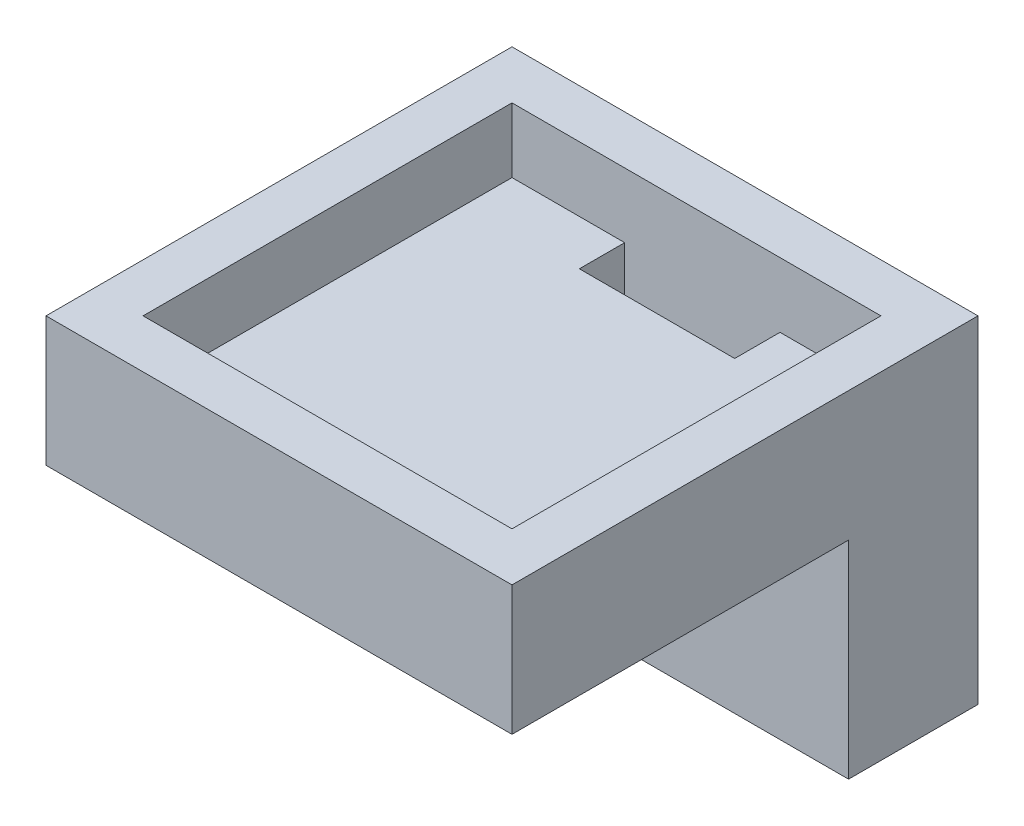
ISO-10303-21;
HEADER;
FILE_DESCRIPTION(('STEP AP214'),'2;1');
FILE_NAME('part.step','',(''),(''),'','','');
FILE_SCHEMA(('AUTOMOTIVE_DESIGN { 1 0 10303 214 1 1 1 1 }'));
ENDSEC;
DATA;
#1=APPLICATION_CONTEXT('core data for automotive mechanical design processes');
#2=APPLICATION_PROTOCOL_DEFINITION('international standard','automotive_design',2000,#1);
#3=PRODUCT_CONTEXT('',#1,'mechanical');
#4=PRODUCT('Part','Part','',(#3));
#5=PRODUCT_RELATED_PRODUCT_CATEGORY('part','',(#4));
#6=PRODUCT_DEFINITION_FORMATION('','',#4);
#7=PRODUCT_DEFINITION_CONTEXT('part definition',#1,'design');
#8=PRODUCT_DEFINITION('design','',#6,#7);
#9=PRODUCT_DEFINITION_SHAPE('','',#8);
#10=(LENGTH_UNIT() NAMED_UNIT(*) SI_UNIT(.MILLI.,.METRE.));
#11=(NAMED_UNIT(*) PLANE_ANGLE_UNIT() SI_UNIT($,.RADIAN.));
#12=(NAMED_UNIT(*) SI_UNIT($,.STERADIAN.) SOLID_ANGLE_UNIT());
#13=UNCERTAINTY_MEASURE_WITH_UNIT(LENGTH_MEASURE(1.E-05),#10,'distance_accuracy_value','');
#14=(GEOMETRIC_REPRESENTATION_CONTEXT(3) GLOBAL_UNCERTAINTY_ASSIGNED_CONTEXT((#13)) GLOBAL_UNIT_ASSIGNED_CONTEXT((#10,
#11,#12)) REPRESENTATION_CONTEXT('',''));
#15=CARTESIAN_POINT('',(0.,0.,0.));
#16=DIRECTION('',(0.,0.,1.));
#17=DIRECTION('',(1.,0.,0.));
#18=AXIS2_PLACEMENT_3D('',#15,#16,#17);
#19=CARTESIAN_POINT('',(0.,5.,0.));
#20=DIRECTION('',(0.,1.,0.));
#21=DIRECTION('',(0.,0.,1.));
#22=AXIS2_PLACEMENT_3D('',#19,#20,#21);
#23=PLANE('',#22);
#24=DIRECTION('',(1.,0.,0.));
#25=VECTOR('',#24,1.);
#26=CARTESIAN_POINT('',(0.,5.,-14.25));
#27=LINE('',#26,#25);
#28=CARTESIAN_POINT('',(6.45474748590523,5.,-14.25));
#29=VERTEX_POINT('',#28);
#30=CARTESIAN_POINT('',(14.25,5.,-14.25));
#31=VERTEX_POINT('',#30);
#32=EDGE_CURVE('E244',#29,#31,#27,.T.);
#33=ORIENTED_EDGE('',*,*,#32,.F.);
#34=DIRECTION('',(0.,0.,-1.));
#35=VECTOR('',#34,1.);
#36=CARTESIAN_POINT('',(6.45474748590523,5.,-14.25));
#37=LINE('',#36,#35);
#38=CARTESIAN_POINT('',(6.45474748590523,5.,-10.75));
#39=VERTEX_POINT('',#38);
#40=EDGE_CURVE('E259',#39,#29,#37,.T.);
#41=ORIENTED_EDGE('',*,*,#40,.F.);
#42=DIRECTION('',(1.,0.,0.));
#43=VECTOR('',#42,1.);
#44=CARTESIAN_POINT('',(-5.54525251409477,5.,-10.75));
#45=LINE('',#44,#43);
#46=CARTESIAN_POINT('',(-5.54525251409477,5.,-10.75));
#47=VERTEX_POINT('',#46);
#48=EDGE_CURVE('E265',#47,#39,#45,.T.);
#49=ORIENTED_EDGE('',*,*,#48,.F.);
#50=DIRECTION('',(0.,0.,1.));
#51=VECTOR('',#50,1.);
#52=CARTESIAN_POINT('',(-5.54525251409477,5.,-14.25));
#53=LINE('',#52,#51);
#54=CARTESIAN_POINT('',(-5.54525251409477,5.,-14.25));
#55=VERTEX_POINT('',#54);
#56=EDGE_CURVE('E148',#55,#47,#53,.T.);
#57=ORIENTED_EDGE('',*,*,#56,.F.);
#58=CARTESIAN_POINT('',(-14.25,5.,-14.25));
#59=VERTEX_POINT('',#58);
#60=EDGE_CURVE('E245',#59,#55,#27,.T.);
#61=ORIENTED_EDGE('',*,*,#60,.F.);
#62=DIRECTION('',(0.,0.,-1.));
#63=VECTOR('',#62,1.);
#64=CARTESIAN_POINT('',(-14.25,5.,0.));
#65=LINE('',#64,#63);
#66=CARTESIAN_POINT('',(-14.25,5.,14.25));
#67=VERTEX_POINT('',#66);
#68=EDGE_CURVE('E253',#67,#59,#65,.T.);
#69=ORIENTED_EDGE('',*,*,#68,.F.);
#70=DIRECTION('',(-1.,0.,0.));
#71=VECTOR('',#70,1.);
#72=CARTESIAN_POINT('',(0.,5.,14.25));
#73=LINE('',#72,#71);
#74=CARTESIAN_POINT('',(14.25,5.,14.25));
#75=VERTEX_POINT('',#74);
#76=EDGE_CURVE('E249',#75,#67,#73,.T.);
#77=ORIENTED_EDGE('',*,*,#76,.F.);
#78=DIRECTION('',(0.,0.,1.));
#79=VECTOR('',#78,1.);
#80=CARTESIAN_POINT('',(14.25,5.,0.));
#81=LINE('',#80,#79);
#82=EDGE_CURVE('E63',#31,#75,#81,.T.);
#83=ORIENTED_EDGE('',*,*,#82,.F.);
#84=EDGE_LOOP('',(#33,#41,#49,#57,#61,#69,#77,#83));
#85=FACE_BOUND('',#84,.T.);
#86=ADVANCED_FACE('F39',(#85),#23,.T.);
#87=CARTESIAN_POINT('',(0.,0.,0.));
#88=DIRECTION('',(0.,1.,0.));
#89=DIRECTION('',(0.,0.,1.));
#90=AXIS2_PLACEMENT_3D('',#87,#88,#89);
#91=PLANE('',#90);
#92=DIRECTION('',(0.,0.,1.));
#93=VECTOR('',#92,1.);
#94=CARTESIAN_POINT('',(-18.,0.,-18.));
#95=LINE('',#94,#93);
#96=CARTESIAN_POINT('',(-18.,0.,-8.00000000000003));
#97=VERTEX_POINT('',#96);
#98=CARTESIAN_POINT('',(-18.,0.,18.));
#99=VERTEX_POINT('',#98);
#100=EDGE_CURVE('E279',#97,#99,#95,.T.);
#101=ORIENTED_EDGE('',*,*,#100,.F.);
#102=DIRECTION('',(1.,0.,0.));
#103=VECTOR('',#102,1.);
#104=CARTESIAN_POINT('',(-18.,0.,-8.00000000000003));
#105=LINE('',#104,#103);
#106=CARTESIAN_POINT('',(18.,0.,-8.00000000000003));
#107=VERTEX_POINT('',#106);
#108=EDGE_CURVE('E176',#97,#107,#105,.T.);
#109=ORIENTED_EDGE('',*,*,#108,.T.);
#110=DIRECTION('',(0.,0.,-1.));
#111=VECTOR('',#110,1.);
#112=CARTESIAN_POINT('',(18.,0.,-18.));
#113=LINE('',#112,#111);
#114=CARTESIAN_POINT('',(18.,0.,18.));
#115=VERTEX_POINT('',#114);
#116=EDGE_CURVE('E275',#115,#107,#113,.T.);
#117=ORIENTED_EDGE('',*,*,#116,.F.);
#118=DIRECTION('',(1.,0.,0.));
#119=VECTOR('',#118,1.);
#120=CARTESIAN_POINT('',(-18.,0.,18.));
#121=LINE('',#120,#119);
#122=EDGE_CURVE('E282',#99,#115,#121,.T.);
#123=ORIENTED_EDGE('',*,*,#122,.F.);
#124=EDGE_LOOP('',(#101,#109,#117,#123));
#125=FACE_BOUND('',#124,.T.);
#126=ADVANCED_FACE('F313',(#125),#91,.F.);
#127=CARTESIAN_POINT('',(18.,5.,-18.));
#128=DIRECTION('',(-1.,0.,0.));
#129=DIRECTION('',(0.,0.,1.));
#130=AXIS2_PLACEMENT_3D('',#127,#128,#129);
#131=PLANE('',#130);
#132=ORIENTED_EDGE('',*,*,#116,.T.);
#133=DIRECTION('',(0.,1.,0.));
#134=VECTOR('',#133,1.);
#135=CARTESIAN_POINT('',(18.,-16.,-8.00000000000003));
#136=LINE('',#135,#134);
#137=CARTESIAN_POINT('',(18.,-16.,-8.00000000000003));
#138=VERTEX_POINT('',#137);
#139=EDGE_CURVE('E55',#138,#107,#136,.T.);
#140=ORIENTED_EDGE('',*,*,#139,.F.);
#141=DIRECTION('',(0.,0.,-1.));
#142=VECTOR('',#141,1.);
#143=CARTESIAN_POINT('',(18.,-16.,-18.));
#144=LINE('',#143,#142);
#145=CARTESIAN_POINT('',(18.,-16.,-18.));
#146=VERTEX_POINT('',#145);
#147=EDGE_CURVE('E184',#138,#146,#144,.T.);
#148=ORIENTED_EDGE('',*,*,#147,.T.);
#149=DIRECTION('',(0.,-1.,0.));
#150=VECTOR('',#149,1.);
#151=CARTESIAN_POINT('',(18.,5.,-18.));
#152=LINE('',#151,#150);
#153=CARTESIAN_POINT('',(18.,10.,-18.));
#154=VERTEX_POINT('',#153);
#155=EDGE_CURVE('E11',#154,#146,#152,.T.);
#156=ORIENTED_EDGE('',*,*,#155,.F.);
#157=DIRECTION('',(0.,0.,-1.));
#158=VECTOR('',#157,1.);
#159=CARTESIAN_POINT('',(18.,10.,-18.));
#160=LINE('',#159,#158);
#161=CARTESIAN_POINT('',(18.,10.,18.));
#162=VERTEX_POINT('',#161);
#163=EDGE_CURVE('E228',#162,#154,#160,.T.);
#164=ORIENTED_EDGE('',*,*,#163,.F.);
#165=DIRECTION('',(0.,-1.,0.));
#166=VECTOR('',#165,1.);
#167=CARTESIAN_POINT('',(18.,5.,18.));
#168=LINE('',#167,#166);
#169=EDGE_CURVE('E285',#162,#115,#168,.T.);
#170=ORIENTED_EDGE('',*,*,#169,.T.);
#171=EDGE_LOOP('',(#132,#140,#148,#156,#164,#170));
#172=FACE_BOUND('',#171,.T.);
#173=ADVANCED_FACE('F41',(#172),#131,.F.);
#174=CARTESIAN_POINT('',(-18.,5.,-18.));
#175=DIRECTION('',(0.,0.,1.));
#176=DIRECTION('',(1.,0.,0.));
#177=AXIS2_PLACEMENT_3D('',#174,#175,#176);
#178=PLANE('',#177);
#179=ORIENTED_EDGE('',*,*,#155,.T.);
#180=DIRECTION('',(-1.,0.,0.));
#181=VECTOR('',#180,1.);
#182=CARTESIAN_POINT('',(-18.,-16.,-18.));
#183=LINE('',#182,#181);
#184=CARTESIAN_POINT('',(-18.,-16.,-18.));
#185=VERTEX_POINT('',#184);
#186=EDGE_CURVE('E188',#146,#185,#183,.T.);
#187=ORIENTED_EDGE('',*,*,#186,.T.);
#188=DIRECTION('',(0.,-1.,0.));
#189=VECTOR('',#188,1.);
#190=CARTESIAN_POINT('',(-18.,5.,-18.));
#191=LINE('',#190,#189);
#192=CARTESIAN_POINT('',(-18.,10.,-18.));
#193=VERTEX_POINT('',#192);
#194=EDGE_CURVE('E48',#193,#185,#191,.T.);
#195=ORIENTED_EDGE('',*,*,#194,.F.);
#196=DIRECTION('',(-1.,0.,0.));
#197=VECTOR('',#196,1.);
#198=CARTESIAN_POINT('',(-18.,10.,-18.));
#199=LINE('',#198,#197);
#200=EDGE_CURVE('E232',#154,#193,#199,.T.);
#201=ORIENTED_EDGE('',*,*,#200,.F.);
#202=EDGE_LOOP('',(#179,#187,#195,#201));
#203=FACE_BOUND('',#202,.T.);
#204=ADVANCED_FACE('F302',(#203),#178,.F.);
#205=CARTESIAN_POINT('',(-18.,5.,-18.));
#206=DIRECTION('',(1.,0.,0.));
#207=DIRECTION('',(0.,0.,-1.));
#208=AXIS2_PLACEMENT_3D('',#205,#206,#207);
#209=PLANE('',#208);
#210=ORIENTED_EDGE('',*,*,#194,.T.);
#211=DIRECTION('',(0.,0.,1.));
#212=VECTOR('',#211,1.);
#213=CARTESIAN_POINT('',(-18.,-16.,-18.));
#214=LINE('',#213,#212);
#215=CARTESIAN_POINT('',(-18.,-16.,-8.00000000000003));
#216=VERTEX_POINT('',#215);
#217=EDGE_CURVE('E177',#185,#216,#214,.T.);
#218=ORIENTED_EDGE('',*,*,#217,.T.);
#219=DIRECTION('',(0.,1.,0.));
#220=VECTOR('',#219,1.);
#221=CARTESIAN_POINT('',(-18.,-16.,-8.00000000000003));
#222=LINE('',#221,#220);
#223=EDGE_CURVE('E192',#216,#97,#222,.T.);
#224=ORIENTED_EDGE('',*,*,#223,.T.);
#225=ORIENTED_EDGE('',*,*,#100,.T.);
#226=DIRECTION('',(0.,-1.,0.));
#227=VECTOR('',#226,1.);
#228=CARTESIAN_POINT('',(-18.,5.,18.));
#229=LINE('',#228,#227);
#230=CARTESIAN_POINT('',(-18.,10.,18.));
#231=VERTEX_POINT('',#230);
#232=EDGE_CURVE('E289',#231,#99,#229,.T.);
#233=ORIENTED_EDGE('',*,*,#232,.F.);
#234=DIRECTION('',(0.,0.,1.));
#235=VECTOR('',#234,1.);
#236=CARTESIAN_POINT('',(-18.,10.,-18.));
#237=LINE('',#236,#235);
#238=EDGE_CURVE('E236',#193,#231,#237,.T.);
#239=ORIENTED_EDGE('',*,*,#238,.F.);
#240=EDGE_LOOP('',(#210,#218,#224,#225,#233,#239));
#241=FACE_BOUND('',#240,.T.);
#242=ADVANCED_FACE('F296',(#241),#209,.F.);
#243=CARTESIAN_POINT('',(-18.,5.,18.));
#244=DIRECTION('',(0.,0.,-1.));
#245=DIRECTION('',(-1.,0.,0.));
#246=AXIS2_PLACEMENT_3D('',#243,#244,#245);
#247=PLANE('',#246);
#248=ORIENTED_EDGE('',*,*,#122,.T.);
#249=ORIENTED_EDGE('',*,*,#169,.F.);
#250=DIRECTION('',(1.,0.,0.));
#251=VECTOR('',#250,1.);
#252=CARTESIAN_POINT('',(-18.,10.,18.));
#253=LINE('',#252,#251);
#254=EDGE_CURVE('E240',#231,#162,#253,.T.);
#255=ORIENTED_EDGE('',*,*,#254,.F.);
#256=ORIENTED_EDGE('',*,*,#232,.T.);
#257=EDGE_LOOP('',(#248,#249,#255,#256));
#258=FACE_BOUND('',#257,.T.);
#259=ADVANCED_FACE('F311',(#258),#247,.F.);
#260=CARTESIAN_POINT('',(6.45474748590523,5.,-14.25));
#261=DIRECTION('',(-1.,0.,0.));
#262=DIRECTION('',(0.,0.,1.));
#263=AXIS2_PLACEMENT_3D('',#260,#261,#262);
#264=PLANE('',#263);
#265=DIRECTION('',(0.,-1.,0.));
#266=VECTOR('',#265,1.);
#267=CARTESIAN_POINT('',(6.45474748590523,5.,-14.25));
#268=LINE('',#267,#266);
#269=CARTESIAN_POINT('',(6.45474748590523,-16.,-14.25));
#270=VERTEX_POINT('',#269);
#271=EDGE_CURVE('E272',#29,#270,#268,.T.);
#272=ORIENTED_EDGE('',*,*,#271,.T.);
#273=DIRECTION('',(0.,0.,-1.));
#274=VECTOR('',#273,1.);
#275=CARTESIAN_POINT('',(6.45474748590523,-16.,-14.25));
#276=LINE('',#275,#274);
#277=CARTESIAN_POINT('',(6.45474748590523,-16.,-10.75));
#278=VERTEX_POINT('',#277);
#279=EDGE_CURVE('E163',#278,#270,#276,.T.);
#280=ORIENTED_EDGE('',*,*,#279,.F.);
#281=DIRECTION('',(0.,-1.,0.));
#282=VECTOR('',#281,1.);
#283=CARTESIAN_POINT('',(6.45474748590523,5.,-10.75));
#284=LINE('',#283,#282);
#285=EDGE_CURVE('E153',#39,#278,#284,.T.);
#286=ORIENTED_EDGE('',*,*,#285,.F.);
#287=ORIENTED_EDGE('',*,*,#40,.T.);
#288=EDGE_LOOP('',(#272,#280,#286,#287));
#289=FACE_BOUND('',#288,.T.);
#290=ADVANCED_FACE('F347',(#289),#264,.T.);
#291=CARTESIAN_POINT('',(-5.54525251409477,5.,-14.25));
#292=DIRECTION('',(0.,0.,1.));
#293=DIRECTION('',(1.,0.,0.));
#294=AXIS2_PLACEMENT_3D('',#291,#292,#293);
#295=PLANE('',#294);
#296=DIRECTION('',(0.,-1.,0.));
#297=VECTOR('',#296,1.);
#298=CARTESIAN_POINT('',(-5.54525251409477,5.,-14.25));
#299=LINE('',#298,#297);
#300=CARTESIAN_POINT('',(-5.54525251409477,-16.,-14.25));
#301=VERTEX_POINT('',#300);
#302=EDGE_CURVE('E152',#55,#301,#299,.T.);
#303=ORIENTED_EDGE('',*,*,#302,.T.);
#304=DIRECTION('',(-1.,0.,0.));
#305=VECTOR('',#304,1.);
#306=CARTESIAN_POINT('',(-5.54525251409477,-16.,-14.25));
#307=LINE('',#306,#305);
#308=EDGE_CURVE('E168',#270,#301,#307,.T.);
#309=ORIENTED_EDGE('',*,*,#308,.F.);
#310=ORIENTED_EDGE('',*,*,#271,.F.);
#311=ORIENTED_EDGE('',*,*,#32,.T.);
#312=DIRECTION('',(0.,-1.,0.));
#313=VECTOR('',#312,1.);
#314=CARTESIAN_POINT('',(14.25,10.,-14.25));
#315=LINE('',#314,#313);
#316=CARTESIAN_POINT('',(14.25,10.,-14.25));
#317=VERTEX_POINT('',#316);
#318=EDGE_CURVE('E224',#317,#31,#315,.T.);
#319=ORIENTED_EDGE('',*,*,#318,.F.);
#320=DIRECTION('',(-1.,0.,0.));
#321=VECTOR('',#320,1.);
#322=CARTESIAN_POINT('',(-14.25,10.,-14.25));
#323=LINE('',#322,#321);
#324=CARTESIAN_POINT('',(-14.25,10.,-14.25));
#325=VERTEX_POINT('',#324);
#326=EDGE_CURVE('E202',#317,#325,#323,.T.);
#327=ORIENTED_EDGE('',*,*,#326,.T.);
#328=DIRECTION('',(0.,-1.,0.));
#329=VECTOR('',#328,1.);
#330=CARTESIAN_POINT('',(-14.25,10.,-14.25));
#331=LINE('',#330,#329);
#332=EDGE_CURVE('E220',#325,#59,#331,.T.);
#333=ORIENTED_EDGE('',*,*,#332,.T.);
#334=ORIENTED_EDGE('',*,*,#60,.T.);
#335=EDGE_LOOP('',(#303,#309,#310,#311,#319,#327,#333,#334));
#336=FACE_BOUND('',#335,.T.);
#337=ADVANCED_FACE('F327',(#336),#295,.T.);
#338=CARTESIAN_POINT('',(-5.54525251409477,5.,-14.25));
#339=DIRECTION('',(1.,0.,0.));
#340=DIRECTION('',(0.,0.,-1.));
#341=AXIS2_PLACEMENT_3D('',#338,#339,#340);
#342=PLANE('',#341);
#343=DIRECTION('',(0.,-1.,0.));
#344=VECTOR('',#343,1.);
#345=CARTESIAN_POINT('',(-5.54525251409477,5.,-10.75));
#346=LINE('',#345,#344);
#347=CARTESIAN_POINT('',(-5.54525251409477,-16.,-10.75));
#348=VERTEX_POINT('',#347);
#349=EDGE_CURVE('E141',#47,#348,#346,.T.);
#350=ORIENTED_EDGE('',*,*,#349,.T.);
#351=DIRECTION('',(0.,0.,1.));
#352=VECTOR('',#351,1.);
#353=CARTESIAN_POINT('',(-5.54525251409477,-16.,-14.25));
#354=LINE('',#353,#352);
#355=EDGE_CURVE('E145',#301,#348,#354,.T.);
#356=ORIENTED_EDGE('',*,*,#355,.F.);
#357=ORIENTED_EDGE('',*,*,#302,.F.);
#358=ORIENTED_EDGE('',*,*,#56,.T.);
#359=EDGE_LOOP('',(#350,#356,#357,#358));
#360=FACE_BOUND('',#359,.T.);
#361=ADVANCED_FACE('F143',(#360),#342,.T.);
#362=CARTESIAN_POINT('',(-5.54525251409477,5.,-10.75));
#363=DIRECTION('',(0.,0.,-1.));
#364=DIRECTION('',(-1.,0.,0.));
#365=AXIS2_PLACEMENT_3D('',#362,#363,#364);
#366=PLANE('',#365);
#367=ORIENTED_EDGE('',*,*,#285,.T.);
#368=DIRECTION('',(1.,0.,0.));
#369=VECTOR('',#368,1.);
#370=CARTESIAN_POINT('',(-5.54525251409477,-16.,-10.75));
#371=LINE('',#370,#369);
#372=EDGE_CURVE('E156',#348,#278,#371,.T.);
#373=ORIENTED_EDGE('',*,*,#372,.F.);
#374=ORIENTED_EDGE('',*,*,#349,.F.);
#375=ORIENTED_EDGE('',*,*,#48,.T.);
#376=EDGE_LOOP('',(#367,#373,#374,#375));
#377=FACE_BOUND('',#376,.T.);
#378=ADVANCED_FACE('F157',(#377),#366,.T.);
#379=CARTESIAN_POINT('',(0.,10.,0.));
#380=DIRECTION('',(0.,1.,0.));
#381=DIRECTION('',(0.,0.,1.));
#382=AXIS2_PLACEMENT_3D('',#379,#380,#381);
#383=PLANE('',#382);
#384=ORIENTED_EDGE('',*,*,#163,.T.);
#385=ORIENTED_EDGE('',*,*,#200,.T.);
#386=ORIENTED_EDGE('',*,*,#238,.T.);
#387=ORIENTED_EDGE('',*,*,#254,.T.);
#388=EDGE_LOOP('',(#384,#385,#386,#387));
#389=FACE_BOUND('',#388,.T.);
#390=ORIENTED_EDGE('',*,*,#326,.F.);
#391=DIRECTION('',(0.,0.,-1.));
#392=VECTOR('',#391,1.);
#393=CARTESIAN_POINT('',(14.25,10.,-14.25));
#394=LINE('',#393,#392);
#395=CARTESIAN_POINT('',(14.25,10.,14.25));
#396=VERTEX_POINT('',#395);
#397=EDGE_CURVE('E197',#396,#317,#394,.T.);
#398=ORIENTED_EDGE('',*,*,#397,.F.);
#399=DIRECTION('',(1.,0.,0.));
#400=VECTOR('',#399,1.);
#401=CARTESIAN_POINT('',(-14.25,10.,14.25));
#402=LINE('',#401,#400);
#403=CARTESIAN_POINT('',(-14.25,10.,14.25));
#404=VERTEX_POINT('',#403);
#405=EDGE_CURVE('E209',#404,#396,#402,.T.);
#406=ORIENTED_EDGE('',*,*,#405,.F.);
#407=DIRECTION('',(0.,0.,1.));
#408=VECTOR('',#407,1.);
#409=CARTESIAN_POINT('',(-14.25,10.,-14.25));
#410=LINE('',#409,#408);
#411=EDGE_CURVE('E205',#325,#404,#410,.T.);
#412=ORIENTED_EDGE('',*,*,#411,.F.);
#413=EDGE_LOOP('',(#390,#398,#406,#412));
#414=FACE_BOUND('',#413,.T.);
#415=ADVANCED_FACE('F315',(#389,#414),#383,.T.);
#416=CARTESIAN_POINT('',(14.25,10.,-14.25));
#417=DIRECTION('',(-1.,0.,0.));
#418=DIRECTION('',(0.,0.,1.));
#419=AXIS2_PLACEMENT_3D('',#416,#417,#418);
#420=PLANE('',#419);
#421=ORIENTED_EDGE('',*,*,#318,.T.);
#422=ORIENTED_EDGE('',*,*,#82,.T.);
#423=DIRECTION('',(0.,-1.,0.));
#424=VECTOR('',#423,1.);
#425=CARTESIAN_POINT('',(14.25,10.,14.25));
#426=LINE('',#425,#424);
#427=EDGE_CURVE('E212',#396,#75,#426,.T.);
#428=ORIENTED_EDGE('',*,*,#427,.F.);
#429=ORIENTED_EDGE('',*,*,#397,.T.);
#430=EDGE_LOOP('',(#421,#422,#428,#429));
#431=FACE_BOUND('',#430,.T.);
#432=ADVANCED_FACE('F318',(#431),#420,.T.);
#433=CARTESIAN_POINT('',(-14.25,10.,-14.25));
#434=DIRECTION('',(1.,0.,0.));
#435=DIRECTION('',(0.,0.,-1.));
#436=AXIS2_PLACEMENT_3D('',#433,#434,#435);
#437=PLANE('',#436);
#438=DIRECTION('',(0.,-1.,0.));
#439=VECTOR('',#438,1.);
#440=CARTESIAN_POINT('',(-14.25,10.,14.25));
#441=LINE('',#440,#439);
#442=EDGE_CURVE('E216',#404,#67,#441,.T.);
#443=ORIENTED_EDGE('',*,*,#442,.T.);
#444=ORIENTED_EDGE('',*,*,#68,.T.);
#445=ORIENTED_EDGE('',*,*,#332,.F.);
#446=ORIENTED_EDGE('',*,*,#411,.T.);
#447=EDGE_LOOP('',(#443,#444,#445,#446));
#448=FACE_BOUND('',#447,.T.);
#449=ADVANCED_FACE('F329',(#448),#437,.T.);
#450=CARTESIAN_POINT('',(-14.25,10.,14.25));
#451=DIRECTION('',(0.,0.,-1.));
#452=DIRECTION('',(-1.,0.,0.));
#453=AXIS2_PLACEMENT_3D('',#450,#451,#452);
#454=PLANE('',#453);
#455=ORIENTED_EDGE('',*,*,#427,.T.);
#456=ORIENTED_EDGE('',*,*,#76,.T.);
#457=ORIENTED_EDGE('',*,*,#442,.F.);
#458=ORIENTED_EDGE('',*,*,#405,.T.);
#459=EDGE_LOOP('',(#455,#456,#457,#458));
#460=FACE_BOUND('',#459,.T.);
#461=ADVANCED_FACE('F331',(#460),#454,.T.);
#462=CARTESIAN_POINT('',(-18.,-16.,-8.00000000000003));
#463=DIRECTION('',(0.,0.,1.));
#464=DIRECTION('',(1.,0.,0.));
#465=AXIS2_PLACEMENT_3D('',#462,#463,#464);
#466=PLANE('',#465);
#467=ORIENTED_EDGE('',*,*,#108,.F.);
#468=ORIENTED_EDGE('',*,*,#223,.F.);
#469=DIRECTION('',(1.,0.,0.));
#470=VECTOR('',#469,1.);
#471=CARTESIAN_POINT('',(-18.,-16.,-8.00000000000003));
#472=LINE('',#471,#470);
#473=EDGE_CURVE('E181',#216,#138,#472,.T.);
#474=ORIENTED_EDGE('',*,*,#473,.T.);
#475=ORIENTED_EDGE('',*,*,#139,.T.);
#476=EDGE_LOOP('',(#467,#468,#474,#475));
#477=FACE_BOUND('',#476,.T.);
#478=ADVANCED_FACE('F305',(#477),#466,.T.);
#479=CARTESIAN_POINT('',(0.,-16.,0.));
#480=DIRECTION('',(0.,1.,0.));
#481=DIRECTION('',(0.,0.,1.));
#482=AXIS2_PLACEMENT_3D('',#479,#480,#481);
#483=PLANE('',#482);
#484=ORIENTED_EDGE('',*,*,#308,.T.);
#485=ORIENTED_EDGE('',*,*,#355,.T.);
#486=ORIENTED_EDGE('',*,*,#372,.T.);
#487=ORIENTED_EDGE('',*,*,#279,.T.);
#488=EDGE_LOOP('',(#484,#485,#486,#487));
#489=FACE_BOUND('',#488,.T.);
#490=ORIENTED_EDGE('',*,*,#217,.F.);
#491=ORIENTED_EDGE('',*,*,#186,.F.);
#492=ORIENTED_EDGE('',*,*,#147,.F.);
#493=ORIENTED_EDGE('',*,*,#473,.F.);
#494=EDGE_LOOP('',(#490,#491,#492,#493));
#495=FACE_BOUND('',#494,.T.);
#496=ADVANCED_FACE('F165',(#489,#495),#483,.F.);
#497=CLOSED_SHELL('',(#86,#126,#173,#204,#242,#259,#290,#337,#361,#378,#415,#432,#449,#461,#478,#496));
#498=MANIFOLD_SOLID_BREP('B2',#497);
#499=ADVANCED_BREP_SHAPE_REPRESENTATION('',(#18,#498),#14);
#500=SHAPE_DEFINITION_REPRESENTATION(#9,#499);
ENDSEC;
END-ISO-10303-21;
